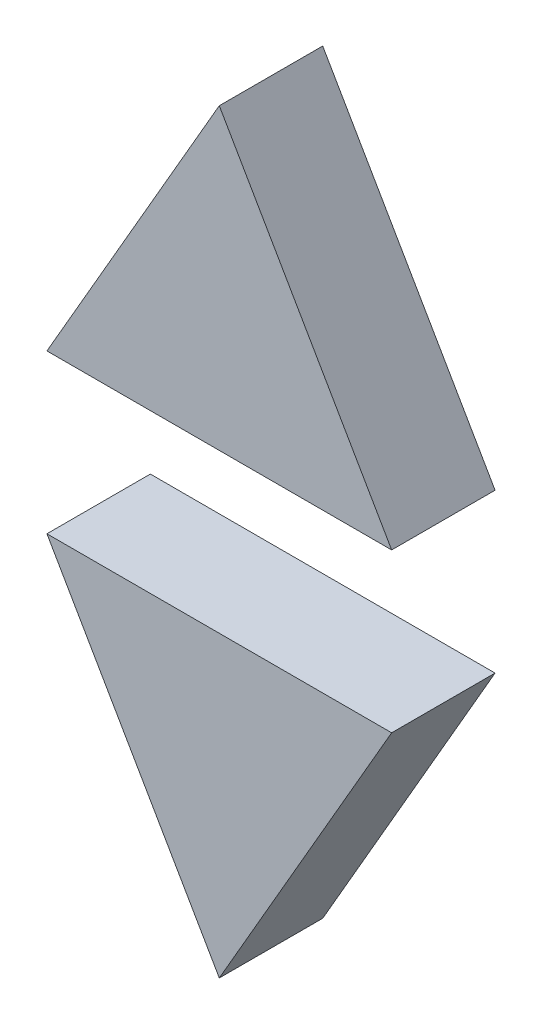
ISO-10303-21;
HEADER;
FILE_DESCRIPTION(('STEP AP214'),'2;1');
FILE_NAME('part.step','',(''),(''),'','','');
FILE_SCHEMA(('AUTOMOTIVE_DESIGN { 1 0 10303 214 1 1 1 1 }'));
ENDSEC;
DATA;
#1=APPLICATION_CONTEXT('core data for automotive mechanical design processes');
#2=APPLICATION_PROTOCOL_DEFINITION('international standard','automotive_design',2000,#1);
#3=PRODUCT_CONTEXT('',#1,'mechanical');
#4=PRODUCT('Part','Part','',(#3));
#5=PRODUCT_RELATED_PRODUCT_CATEGORY('part','',(#4));
#6=PRODUCT_DEFINITION_FORMATION('','',#4);
#7=PRODUCT_DEFINITION_CONTEXT('part definition',#1,'design');
#8=PRODUCT_DEFINITION('design','',#6,#7);
#9=PRODUCT_DEFINITION_SHAPE('','',#8);
#10=(LENGTH_UNIT() NAMED_UNIT(*) SI_UNIT(.MILLI.,.METRE.));
#11=(NAMED_UNIT(*) PLANE_ANGLE_UNIT() SI_UNIT($,.RADIAN.));
#12=(NAMED_UNIT(*) SI_UNIT($,.STERADIAN.) SOLID_ANGLE_UNIT());
#13=UNCERTAINTY_MEASURE_WITH_UNIT(LENGTH_MEASURE(1.E-05),#10,'distance_accuracy_value','');
#14=(GEOMETRIC_REPRESENTATION_CONTEXT(3) GLOBAL_UNCERTAINTY_ASSIGNED_CONTEXT((#13)) GLOBAL_UNIT_ASSIGNED_CONTEXT((#10,
#11,#12)) REPRESENTATION_CONTEXT('',''));
#15=CARTESIAN_POINT('',(0.,0.,0.));
#16=DIRECTION('',(0.,0.,1.));
#17=DIRECTION('',(1.,0.,0.));
#18=AXIS2_PLACEMENT_3D('',#15,#16,#17);
#19=CARTESIAN_POINT('',(23.1062708619159,-8.07207432702362,3.));
#20=DIRECTION('',(0.86602540378444,0.499999999999998,0.));
#21=DIRECTION('',(-0.499999999999998,0.86602540378444,0.));
#22=AXIS2_PLACEMENT_3D('',#19,#20,#21);
#23=PLANE('',#22);
#24=DIRECTION('',(0.499999999999998,-0.86602540378444,0.));
#25=VECTOR('',#24,1.);
#26=CARTESIAN_POINT('',(23.1062708619159,-8.07207432702362,0.));
#27=LINE('',#26,#25);
#28=CARTESIAN_POINT('',(18.1062708619159,0.588179710820808,0.));
#29=VERTEX_POINT('',#28);
#30=CARTESIAN_POINT('',(23.1062708619159,-8.07207432702362,0.));
#31=VERTEX_POINT('',#30);
#32=EDGE_CURVE('E89',#29,#31,#27,.T.);
#33=ORIENTED_EDGE('',*,*,#32,.T.);
#34=DIRECTION('',(0.,0.,-1.));
#35=VECTOR('',#34,1.);
#36=CARTESIAN_POINT('',(23.1062708619159,-8.07207432702362,3.));
#37=LINE('',#36,#35);
#38=CARTESIAN_POINT('',(23.1062708619159,-8.07207432702362,3.));
#39=VERTEX_POINT('',#38);
#40=EDGE_CURVE('E12',#39,#31,#37,.T.);
#41=ORIENTED_EDGE('',*,*,#40,.F.);
#42=DIRECTION('',(0.499999999999998,-0.86602540378444,0.));
#43=VECTOR('',#42,1.);
#44=CARTESIAN_POINT('',(23.1062708619159,-8.07207432702362,3.));
#45=LINE('',#44,#43);
#46=CARTESIAN_POINT('',(18.1062708619159,0.588179710820808,3.));
#47=VERTEX_POINT('',#46);
#48=EDGE_CURVE('E82',#47,#39,#45,.T.);
#49=ORIENTED_EDGE('',*,*,#48,.F.);
#50=DIRECTION('',(0.,0.,-1.));
#51=VECTOR('',#50,1.);
#52=CARTESIAN_POINT('',(18.1062708619159,0.588179710820808,3.));
#53=LINE('',#52,#51);
#54=EDGE_CURVE('E90',#47,#29,#53,.T.);
#55=ORIENTED_EDGE('',*,*,#54,.T.);
#56=EDGE_LOOP('',(#33,#41,#49,#55));
#57=FACE_BOUND('',#56,.T.);
#58=ADVANCED_FACE('F42',(#57),#23,.F.);
#59=CARTESIAN_POINT('',(28.1062708619159,0.588179710820808,3.));
#60=DIRECTION('',(-0.86602540378444,0.499999999999998,0.));
#61=DIRECTION('',(-0.499999999999998,-0.86602540378444,0.));
#62=AXIS2_PLACEMENT_3D('',#59,#60,#61);
#63=PLANE('',#62);
#64=DIRECTION('',(0.499999999999998,0.86602540378444,0.));
#65=VECTOR('',#64,1.);
#66=CARTESIAN_POINT('',(28.1062708619159,0.588179710820808,0.));
#67=LINE('',#66,#65);
#68=CARTESIAN_POINT('',(28.1062708619159,0.588179710820808,0.));
#69=VERTEX_POINT('',#68);
#70=EDGE_CURVE('E70',#31,#69,#67,.T.);
#71=ORIENTED_EDGE('',*,*,#70,.T.);
#72=DIRECTION('',(0.,0.,-1.));
#73=VECTOR('',#72,1.);
#74=CARTESIAN_POINT('',(28.1062708619159,0.588179710820808,3.));
#75=LINE('',#74,#73);
#76=CARTESIAN_POINT('',(28.1062708619159,0.588179710820808,3.));
#77=VERTEX_POINT('',#76);
#78=EDGE_CURVE('E50',#77,#69,#75,.T.);
#79=ORIENTED_EDGE('',*,*,#78,.F.);
#80=DIRECTION('',(0.499999999999998,0.86602540378444,0.));
#81=VECTOR('',#80,1.);
#82=CARTESIAN_POINT('',(28.1062708619159,0.588179710820808,3.));
#83=LINE('',#82,#81);
#84=EDGE_CURVE('E78',#39,#77,#83,.T.);
#85=ORIENTED_EDGE('',*,*,#84,.F.);
#86=ORIENTED_EDGE('',*,*,#40,.T.);
#87=EDGE_LOOP('',(#71,#79,#85,#86));
#88=FACE_BOUND('',#87,.T.);
#89=ADVANCED_FACE('F79',(#88),#63,.F.);
#90=CARTESIAN_POINT('',(18.1062708619159,0.588179710820808,3.));
#91=DIRECTION('',(0.,-1.,0.));
#92=DIRECTION('',(0.,0.,-1.));
#93=AXIS2_PLACEMENT_3D('',#90,#91,#92);
#94=PLANE('',#93);
#95=DIRECTION('',(-1.,0.,0.));
#96=VECTOR('',#95,1.);
#97=CARTESIAN_POINT('',(18.1062708619159,0.588179710820808,0.));
#98=LINE('',#97,#96);
#99=EDGE_CURVE('E75',#69,#29,#98,.T.);
#100=ORIENTED_EDGE('',*,*,#99,.T.);
#101=ORIENTED_EDGE('',*,*,#54,.F.);
#102=DIRECTION('',(-1.,0.,0.));
#103=VECTOR('',#102,1.);
#104=CARTESIAN_POINT('',(18.1062708619159,0.588179710820808,3.));
#105=LINE('',#104,#103);
#106=EDGE_CURVE('E58',#77,#47,#105,.T.);
#107=ORIENTED_EDGE('',*,*,#106,.F.);
#108=ORIENTED_EDGE('',*,*,#78,.T.);
#109=EDGE_LOOP('',(#100,#101,#107,#108));
#110=FACE_BOUND('',#109,.T.);
#111=ADVANCED_FACE('F97',(#110),#94,.F.);
#112=CARTESIAN_POINT('',(0.,0.,3.));
#113=DIRECTION('',(0.,0.,-1.));
#114=DIRECTION('',(-1.,0.,0.));
#115=AXIS2_PLACEMENT_3D('',#112,#113,#114);
#116=PLANE('',#115);
#117=ORIENTED_EDGE('',*,*,#48,.T.);
#118=ORIENTED_EDGE('',*,*,#84,.T.);
#119=ORIENTED_EDGE('',*,*,#106,.T.);
#120=EDGE_LOOP('',(#117,#118,#119));
#121=FACE_BOUND('',#120,.T.);
#122=ADVANCED_FACE('F85',(#121),#116,.F.);
#123=CARTESIAN_POINT('',(0.,0.,0.));
#124=DIRECTION('',(0.,0.,-1.));
#125=DIRECTION('',(-1.,0.,0.));
#126=AXIS2_PLACEMENT_3D('',#123,#124,#125);
#127=PLANE('',#126);
#128=ORIENTED_EDGE('',*,*,#32,.F.);
#129=ORIENTED_EDGE('',*,*,#99,.F.);
#130=ORIENTED_EDGE('',*,*,#70,.F.);
#131=EDGE_LOOP('',(#128,#129,#130));
#132=FACE_BOUND('',#131,.T.);
#133=ADVANCED_FACE('F98',(#132),#127,.T.);
#134=CLOSED_SHELL('',(#58,#89,#111,#122,#133));
#135=MANIFOLD_SOLID_BREP('B2',#134);
#136=CARTESIAN_POINT('',(28.1062708619159,5.18117553230281,3.));
#137=DIRECTION('',(0.,1.,0.));
#138=DIRECTION('',(0.,0.,1.));
#139=AXIS2_PLACEMENT_3D('',#136,#137,#138);
#140=PLANE('',#139);
#141=DIRECTION('',(1.,0.,0.));
#142=VECTOR('',#141,1.);
#143=CARTESIAN_POINT('',(28.1062708619159,5.18117553230281,0.));
#144=LINE('',#143,#142);
#145=CARTESIAN_POINT('',(18.1062708619159,5.18117553230281,0.));
#146=VERTEX_POINT('',#145);
#147=CARTESIAN_POINT('',(28.1062708619159,5.18117553230281,0.));
#148=VERTEX_POINT('',#147);
#149=EDGE_CURVE('E186',#146,#148,#144,.T.);
#150=ORIENTED_EDGE('',*,*,#149,.T.);
#151=DIRECTION('',(0.,0.,-1.));
#152=VECTOR('',#151,1.);
#153=CARTESIAN_POINT('',(28.1062708619159,5.18117553230281,3.));
#154=LINE('',#153,#152);
#155=CARTESIAN_POINT('',(28.1062708619159,5.18117553230281,3.));
#156=VERTEX_POINT('',#155);
#157=EDGE_CURVE('E40',#156,#148,#154,.T.);
#158=ORIENTED_EDGE('',*,*,#157,.F.);
#159=DIRECTION('',(1.,0.,0.));
#160=VECTOR('',#159,1.);
#161=CARTESIAN_POINT('',(28.1062708619159,5.18117553230281,3.));
#162=LINE('',#161,#160);
#163=CARTESIAN_POINT('',(18.1062708619159,5.18117553230281,3.));
#164=VERTEX_POINT('',#163);
#165=EDGE_CURVE('E179',#164,#156,#162,.T.);
#166=ORIENTED_EDGE('',*,*,#165,.F.);
#167=DIRECTION('',(0.,0.,-1.));
#168=VECTOR('',#167,1.);
#169=CARTESIAN_POINT('',(18.1062708619159,5.18117553230281,3.));
#170=LINE('',#169,#168);
#171=EDGE_CURVE('E187',#164,#146,#170,.T.);
#172=ORIENTED_EDGE('',*,*,#171,.T.);
#173=EDGE_LOOP('',(#150,#158,#166,#172));
#174=FACE_BOUND('',#173,.T.);
#175=ADVANCED_FACE('F139',(#174),#140,.F.);
#176=CARTESIAN_POINT('',(23.1062708619159,13.8414295701472,3.));
#177=DIRECTION('',(-0.86602540378444,-0.499999999999998,0.));
#178=DIRECTION('',(0.499999999999998,-0.86602540378444,0.));
#179=AXIS2_PLACEMENT_3D('',#176,#177,#178);
#180=PLANE('',#179);
#181=DIRECTION('',(-0.499999999999998,0.86602540378444,0.));
#182=VECTOR('',#181,1.);
#183=CARTESIAN_POINT('',(23.1062708619159,13.8414295701472,0.));
#184=LINE('',#183,#182);
#185=CARTESIAN_POINT('',(23.1062708619159,13.8414295701472,0.));
#186=VERTEX_POINT('',#185);
#187=EDGE_CURVE('E167',#148,#186,#184,.T.);
#188=ORIENTED_EDGE('',*,*,#187,.T.);
#189=DIRECTION('',(0.,0.,-1.));
#190=VECTOR('',#189,1.);
#191=CARTESIAN_POINT('',(23.1062708619159,13.8414295701472,3.));
#192=LINE('',#191,#190);
#193=CARTESIAN_POINT('',(23.1062708619159,13.8414295701472,3.));
#194=VERTEX_POINT('',#193);
#195=EDGE_CURVE('E147',#194,#186,#192,.T.);
#196=ORIENTED_EDGE('',*,*,#195,.F.);
#197=DIRECTION('',(-0.499999999999998,0.86602540378444,0.));
#198=VECTOR('',#197,1.);
#199=CARTESIAN_POINT('',(23.1062708619159,13.8414295701472,3.));
#200=LINE('',#199,#198);
#201=EDGE_CURVE('E175',#156,#194,#200,.T.);
#202=ORIENTED_EDGE('',*,*,#201,.F.);
#203=ORIENTED_EDGE('',*,*,#157,.T.);
#204=EDGE_LOOP('',(#188,#196,#202,#203));
#205=FACE_BOUND('',#204,.T.);
#206=ADVANCED_FACE('F176',(#205),#180,.F.);
#207=CARTESIAN_POINT('',(18.1062708619159,5.18117553230281,3.));
#208=DIRECTION('',(0.86602540378444,-0.499999999999998,0.));
#209=DIRECTION('',(0.499999999999998,0.86602540378444,0.));
#210=AXIS2_PLACEMENT_3D('',#207,#208,#209);
#211=PLANE('',#210);
#212=DIRECTION('',(-0.499999999999998,-0.86602540378444,0.));
#213=VECTOR('',#212,1.);
#214=CARTESIAN_POINT('',(18.1062708619159,5.18117553230281,0.));
#215=LINE('',#214,#213);
#216=EDGE_CURVE('E172',#186,#146,#215,.T.);
#217=ORIENTED_EDGE('',*,*,#216,.T.);
#218=ORIENTED_EDGE('',*,*,#171,.F.);
#219=DIRECTION('',(-0.499999999999998,-0.86602540378444,0.));
#220=VECTOR('',#219,1.);
#221=CARTESIAN_POINT('',(18.1062708619159,5.18117553230281,3.));
#222=LINE('',#221,#220);
#223=EDGE_CURVE('E155',#194,#164,#222,.T.);
#224=ORIENTED_EDGE('',*,*,#223,.F.);
#225=ORIENTED_EDGE('',*,*,#195,.T.);
#226=EDGE_LOOP('',(#217,#218,#224,#225));
#227=FACE_BOUND('',#226,.T.);
#228=ADVANCED_FACE('F194',(#227),#211,.F.);
#229=CARTESIAN_POINT('',(0.,0.,3.));
#230=DIRECTION('',(0.,0.,-1.));
#231=DIRECTION('',(-1.,0.,0.));
#232=AXIS2_PLACEMENT_3D('',#229,#230,#231);
#233=PLANE('',#232);
#234=ORIENTED_EDGE('',*,*,#165,.T.);
#235=ORIENTED_EDGE('',*,*,#201,.T.);
#236=ORIENTED_EDGE('',*,*,#223,.T.);
#237=EDGE_LOOP('',(#234,#235,#236));
#238=FACE_BOUND('',#237,.T.);
#239=ADVANCED_FACE('F182',(#238),#233,.F.);
#240=CARTESIAN_POINT('',(0.,0.,0.));
#241=DIRECTION('',(0.,0.,-1.));
#242=DIRECTION('',(-1.,0.,0.));
#243=AXIS2_PLACEMENT_3D('',#240,#241,#242);
#244=PLANE('',#243);
#245=ORIENTED_EDGE('',*,*,#149,.F.);
#246=ORIENTED_EDGE('',*,*,#216,.F.);
#247=ORIENTED_EDGE('',*,*,#187,.F.);
#248=EDGE_LOOP('',(#245,#246,#247));
#249=FACE_BOUND('',#248,.T.);
#250=ADVANCED_FACE('F195',(#249),#244,.T.);
#251=CLOSED_SHELL('',(#175,#206,#228,#239,#250));
#252=MANIFOLD_SOLID_BREP('B6',#251);
#253=ADVANCED_BREP_SHAPE_REPRESENTATION('',(#18,#135,#252),#14);
#254=SHAPE_DEFINITION_REPRESENTATION(#9,#253);
ENDSEC;
END-ISO-10303-21;
